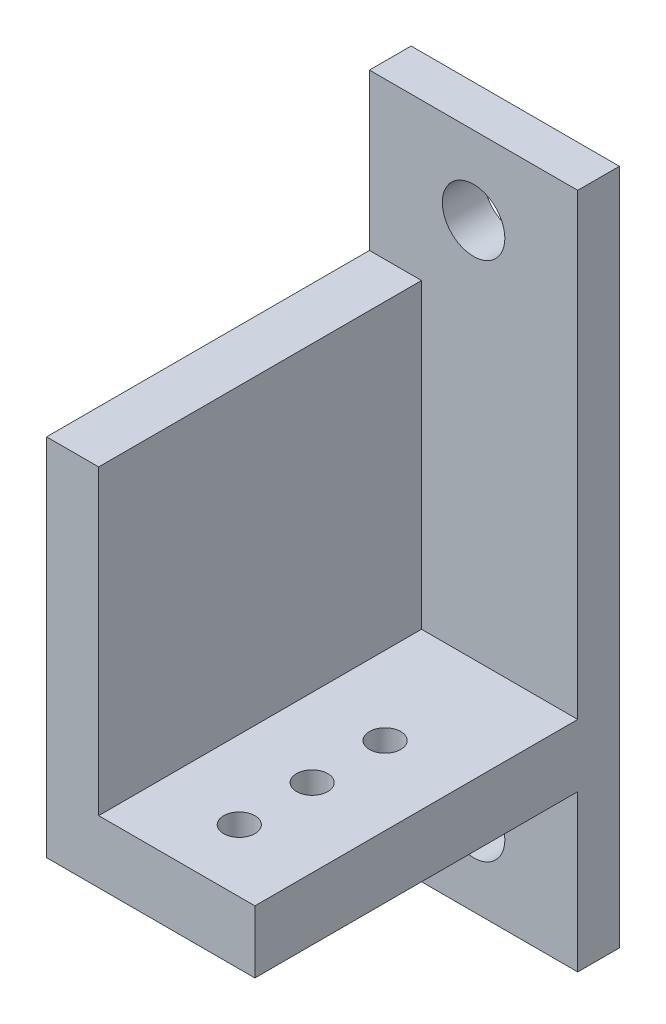
ISO-10303-21;
HEADER;
FILE_DESCRIPTION(('STEP AP214'),'2;1');
FILE_NAME('part.step','',(''),(''),'','','');
FILE_SCHEMA(('AUTOMOTIVE_DESIGN { 1 0 10303 214 1 1 1 1 }'));
ENDSEC;
DATA;
#1=APPLICATION_CONTEXT('core data for automotive mechanical design processes');
#2=APPLICATION_PROTOCOL_DEFINITION('international standard','automotive_design',2000,#1);
#3=PRODUCT_CONTEXT('',#1,'mechanical');
#4=PRODUCT('Part','Part','',(#3));
#5=PRODUCT_RELATED_PRODUCT_CATEGORY('part','',(#4));
#6=PRODUCT_DEFINITION_FORMATION('','',#4);
#7=PRODUCT_DEFINITION_CONTEXT('part definition',#1,'design');
#8=PRODUCT_DEFINITION('design','',#6,#7);
#9=PRODUCT_DEFINITION_SHAPE('','',#8);
#10=(LENGTH_UNIT() NAMED_UNIT(*) SI_UNIT(.MILLI.,.METRE.));
#11=(NAMED_UNIT(*) PLANE_ANGLE_UNIT() SI_UNIT($,.RADIAN.));
#12=(NAMED_UNIT(*) SI_UNIT($,.STERADIAN.) SOLID_ANGLE_UNIT());
#13=UNCERTAINTY_MEASURE_WITH_UNIT(LENGTH_MEASURE(1.E-05),#10,'distance_accuracy_value','');
#14=(GEOMETRIC_REPRESENTATION_CONTEXT(3) GLOBAL_UNCERTAINTY_ASSIGNED_CONTEXT((#13)) GLOBAL_UNIT_ASSIGNED_CONTEXT((#10,
#11,#12)) REPRESENTATION_CONTEXT('',''));
#15=CARTESIAN_POINT('',(0.,0.,0.));
#16=DIRECTION('',(0.,0.,1.));
#17=DIRECTION('',(1.,0.,0.));
#18=AXIS2_PLACEMENT_3D('',#15,#16,#17);
#19=CARTESIAN_POINT('',(-7.63104892590161,-13.3543356203278,35.));
#20=DIRECTION('',(0.,1.,0.));
#21=DIRECTION('',(0.,0.,1.));
#22=AXIS2_PLACEMENT_3D('',#19,#20,#21);
#23=PLANE('',#22);
#24=CARTESIAN_POINT('',(4.86895107409839,-13.3543356203278,22.));
#25=DIRECTION('',(0.,-1.,0.));
#26=DIRECTION('',(0.,0.,-1.));
#27=AXIS2_PLACEMENT_3D('',#24,#25,#26);
#28=CIRCLE('',#27,1.5);
#29=CARTESIAN_POINT('',(4.86895107409839,-13.3543356203278,20.5));
#30=VERTEX_POINT('',#29);
#31=EDGE_CURVE('E161',#30,#30,#28,.T.);
#32=ORIENTED_EDGE('',*,*,#31,.F.);
#33=EDGE_LOOP('',(#32));
#34=FACE_BOUND('',#33,.T.);
#35=CARTESIAN_POINT('',(4.86895107409839,-13.3543356203278,29.));
#36=DIRECTION('',(0.,-1.,0.));
#37=DIRECTION('',(0.,0.,-1.));
#38=AXIS2_PLACEMENT_3D('',#35,#36,#37);
#39=CIRCLE('',#38,1.5);
#40=CARTESIAN_POINT('',(4.86895107409839,-13.3543356203278,27.5));
#41=VERTEX_POINT('',#40);
#42=EDGE_CURVE('E165',#41,#41,#39,.T.);
#43=ORIENTED_EDGE('',*,*,#42,.F.);
#44=EDGE_LOOP('',(#43));
#45=FACE_BOUND('',#44,.T.);
#46=CARTESIAN_POINT('',(4.86895107409839,-13.3543356203278,15.));
#47=DIRECTION('',(0.,-1.,0.));
#48=DIRECTION('',(0.,0.,-1.));
#49=AXIS2_PLACEMENT_3D('',#46,#47,#48);
#50=CIRCLE('',#49,1.5);
#51=CARTESIAN_POINT('',(4.86895107409839,-13.3543356203278,13.5));
#52=VERTEX_POINT('',#51);
#53=EDGE_CURVE('E171',#52,#52,#50,.T.);
#54=ORIENTED_EDGE('',*,*,#53,.F.);
#55=EDGE_LOOP('',(#54));
#56=FACE_BOUND('',#55,.T.);
#57=DIRECTION('',(-1.,0.,0.));
#58=VECTOR('',#57,1.);
#59=CARTESIAN_POINT('',(12.3689510740984,-13.3543356203278,4.));
#60=LINE('',#59,#58);
#61=CARTESIAN_POINT('',(12.3689510740984,-13.3543356203278,4.));
#62=VERTEX_POINT('',#61);
#63=CARTESIAN_POINT('',(-7.63104892590161,-13.3543356203278,4.));
#64=VERTEX_POINT('',#63);
#65=EDGE_CURVE('E48',#62,#64,#60,.T.);
#66=ORIENTED_EDGE('',*,*,#65,.F.);
#67=DIRECTION('',(0.,0.,1.));
#68=VECTOR('',#67,1.);
#69=CARTESIAN_POINT('',(12.3689510740984,-13.3543356203278,0.));
#70=LINE('',#69,#68);
#71=CARTESIAN_POINT('',(12.3689510740984,-13.3543356203278,35.));
#72=VERTEX_POINT('',#71);
#73=EDGE_CURVE('E177',#62,#72,#70,.T.);
#74=ORIENTED_EDGE('',*,*,#73,.T.);
#75=DIRECTION('',(1.,0.,0.));
#76=VECTOR('',#75,1.);
#77=CARTESIAN_POINT('',(-7.63104892590161,-13.3543356203278,35.));
#78=LINE('',#77,#76);
#79=CARTESIAN_POINT('',(-7.63104892590161,-13.3543356203278,35.));
#80=VERTEX_POINT('',#79);
#81=EDGE_CURVE('E198',#80,#72,#78,.T.);
#82=ORIENTED_EDGE('',*,*,#81,.F.);
#83=DIRECTION('',(0.,0.,-1.));
#84=VECTOR('',#83,1.);
#85=CARTESIAN_POINT('',(-7.63104892590161,-13.3543356203278,35.));
#86=LINE('',#85,#84);
#87=EDGE_CURVE('E203',#80,#64,#86,.T.);
#88=ORIENTED_EDGE('',*,*,#87,.T.);
#89=EDGE_LOOP('',(#66,#74,#82,#88));
#90=FACE_BOUND('',#89,.T.);
#91=ADVANCED_FACE('F33',(#34,#45,#56,#90),#23,.F.);
#92=CARTESIAN_POINT('',(-7.63104892590161,21.6456643796722,35.));
#93=DIRECTION('',(0.,-1.,0.));
#94=DIRECTION('',(0.,0.,-1.));
#95=AXIS2_PLACEMENT_3D('',#92,#93,#94);
#96=PLANE('',#95);
#97=DIRECTION('',(1.,0.,0.));
#98=VECTOR('',#97,1.);
#99=CARTESIAN_POINT('',(-2.63104892590161,21.6456643796722,4.));
#100=LINE('',#99,#98);
#101=CARTESIAN_POINT('',(-7.63104892590161,21.6456643796722,4.));
#102=VERTEX_POINT('',#101);
#103=CARTESIAN_POINT('',(-2.63104892590161,21.6456643796722,4.));
#104=VERTEX_POINT('',#103);
#105=EDGE_CURVE('E56',#102,#104,#100,.T.);
#106=ORIENTED_EDGE('',*,*,#105,.F.);
#107=DIRECTION('',(0.,0.,-1.));
#108=VECTOR('',#107,1.);
#109=CARTESIAN_POINT('',(-7.63104892590161,21.6456643796722,35.));
#110=LINE('',#109,#108);
#111=CARTESIAN_POINT('',(-7.63104892590161,21.6456643796722,35.));
#112=VERTEX_POINT('',#111);
#113=EDGE_CURVE('E41',#112,#102,#110,.T.);
#114=ORIENTED_EDGE('',*,*,#113,.F.);
#115=DIRECTION('',(-1.,0.,0.));
#116=VECTOR('',#115,1.);
#117=CARTESIAN_POINT('',(-7.63104892590161,21.6456643796722,35.));
#118=LINE('',#117,#116);
#119=CARTESIAN_POINT('',(-2.63104892590161,21.6456643796722,35.));
#120=VERTEX_POINT('',#119);
#121=EDGE_CURVE('E194',#120,#112,#118,.T.);
#122=ORIENTED_EDGE('',*,*,#121,.F.);
#123=DIRECTION('',(0.,0.,-1.));
#124=VECTOR('',#123,1.);
#125=CARTESIAN_POINT('',(-2.63104892590161,21.6456643796722,35.));
#126=LINE('',#125,#124);
#127=EDGE_CURVE('E158',#120,#104,#126,.T.);
#128=ORIENTED_EDGE('',*,*,#127,.T.);
#129=EDGE_LOOP('',(#106,#114,#122,#128));
#130=FACE_BOUND('',#129,.T.);
#131=ADVANCED_FACE('F35',(#130),#96,.F.);
#132=CARTESIAN_POINT('',(-2.63104892590161,15.6456643796722,35.));
#133=DIRECTION('',(-1.,0.,0.));
#134=DIRECTION('',(0.,-1.,0.));
#135=AXIS2_PLACEMENT_3D('',#132,#133,#134);
#136=PLANE('',#135);
#137=DIRECTION('',(0.,-1.,0.));
#138=VECTOR('',#137,1.);
#139=CARTESIAN_POINT('',(-2.63104892590161,15.6456643796722,4.));
#140=LINE('',#139,#138);
#141=CARTESIAN_POINT('',(-2.63104892590161,-7.35433562032781,4.));
#142=VERTEX_POINT('',#141);
#143=EDGE_CURVE('E156',#104,#142,#140,.T.);
#144=ORIENTED_EDGE('',*,*,#143,.F.);
#145=ORIENTED_EDGE('',*,*,#127,.F.);
#146=DIRECTION('',(0.,1.,0.));
#147=VECTOR('',#146,1.);
#148=CARTESIAN_POINT('',(-2.63104892590161,15.6456643796722,35.));
#149=LINE('',#148,#147);
#150=CARTESIAN_POINT('',(-2.6310489259016,-7.3543356203278,35.));
#151=VERTEX_POINT('',#150);
#152=EDGE_CURVE('E201',#151,#120,#149,.T.);
#153=ORIENTED_EDGE('',*,*,#152,.F.);
#154=DIRECTION('',(0.,0.,-1.));
#155=VECTOR('',#154,1.);
#156=CARTESIAN_POINT('',(-2.63104892590161,-7.35433562032781,35.));
#157=LINE('',#156,#155);
#158=EDGE_CURVE('E183',#151,#142,#157,.T.);
#159=ORIENTED_EDGE('',*,*,#158,.T.);
#160=EDGE_LOOP('',(#144,#145,#153,#159));
#161=FACE_BOUND('',#160,.T.);
#162=ADVANCED_FACE('F214',(#161),#136,.F.);
#163=CARTESIAN_POINT('',(0.,-7.35433562032781,0.));
#164=DIRECTION('',(0.,-1.,0.));
#165=DIRECTION('',(0.,0.,-1.));
#166=AXIS2_PLACEMENT_3D('',#163,#164,#165);
#167=PLANE('',#166);
#168=CARTESIAN_POINT('',(4.86895107409839,-7.35433562032781,15.));
#169=DIRECTION('',(0.,-1.,0.));
#170=DIRECTION('',(0.,0.,-1.));
#171=AXIS2_PLACEMENT_3D('',#168,#169,#170);
#172=CIRCLE('',#171,1.5);
#173=CARTESIAN_POINT('',(4.86895107409839,-7.35433562032781,13.5));
#174=VERTEX_POINT('',#173);
#175=EDGE_CURVE('E174',#174,#174,#172,.T.);
#176=ORIENTED_EDGE('',*,*,#175,.T.);
#177=EDGE_LOOP('',(#176));
#178=FACE_BOUND('',#177,.T.);
#179=CARTESIAN_POINT('',(4.86895107409839,-7.35433562032781,29.));
#180=DIRECTION('',(0.,-1.,0.));
#181=DIRECTION('',(0.,0.,-1.));
#182=AXIS2_PLACEMENT_3D('',#179,#180,#181);
#183=CIRCLE('',#182,1.5);
#184=CARTESIAN_POINT('',(4.86895107409839,-7.35433562032781,27.5));
#185=VERTEX_POINT('',#184);
#186=EDGE_CURVE('E168',#185,#185,#183,.T.);
#187=ORIENTED_EDGE('',*,*,#186,.T.);
#188=EDGE_LOOP('',(#187));
#189=FACE_BOUND('',#188,.T.);
#190=CARTESIAN_POINT('',(4.86895107409839,-7.35433562032781,22.));
#191=DIRECTION('',(0.,-1.,0.));
#192=DIRECTION('',(0.,0.,-1.));
#193=AXIS2_PLACEMENT_3D('',#190,#191,#192);
#194=CIRCLE('',#193,1.5);
#195=CARTESIAN_POINT('',(4.86895107409839,-7.35433562032781,20.5));
#196=VERTEX_POINT('',#195);
#197=EDGE_CURVE('E162',#196,#196,#194,.T.);
#198=ORIENTED_EDGE('',*,*,#197,.T.);
#199=EDGE_LOOP('',(#198));
#200=FACE_BOUND('',#199,.T.);
#201=DIRECTION('',(1.,0.,0.));
#202=VECTOR('',#201,1.);
#203=CARTESIAN_POINT('',(0.,-7.35433562032781,4.));
#204=LINE('',#203,#202);
#205=CARTESIAN_POINT('',(12.3689510740984,-7.35433562032781,4.));
#206=VERTEX_POINT('',#205);
#207=EDGE_CURVE('E11',#142,#206,#204,.T.);
#208=ORIENTED_EDGE('',*,*,#207,.F.);
#209=ORIENTED_EDGE('',*,*,#158,.F.);
#210=DIRECTION('',(-1.,0.,0.));
#211=VECTOR('',#210,1.);
#212=CARTESIAN_POINT('',(12.3689510740984,-7.35433562032781,35.));
#213=LINE('',#212,#211);
#214=CARTESIAN_POINT('',(12.3689510740984,-7.35433562032781,35.));
#215=VERTEX_POINT('',#214);
#216=EDGE_CURVE('E180',#215,#151,#213,.T.);
#217=ORIENTED_EDGE('',*,*,#216,.F.);
#218=DIRECTION('',(0.,0.,1.));
#219=VECTOR('',#218,1.);
#220=CARTESIAN_POINT('',(12.3689510740984,-7.35433562032781,0.));
#221=LINE('',#220,#219);
#222=EDGE_CURVE('E186',#206,#215,#221,.T.);
#223=ORIENTED_EDGE('',*,*,#222,.F.);
#224=EDGE_LOOP('',(#208,#209,#217,#223));
#225=FACE_BOUND('',#224,.T.);
#226=ADVANCED_FACE('F270',(#178,#189,#200,#225),#167,.F.);
#227=CARTESIAN_POINT('',(-7.63104892590161,-13.3543356203278,35.));
#228=DIRECTION('',(1.,0.,0.));
#229=DIRECTION('',(0.,0.,-1.));
#230=AXIS2_PLACEMENT_3D('',#227,#228,#229);
#231=PLANE('',#230);
#232=DIRECTION('',(0.,-1.,0.));
#233=VECTOR('',#232,1.);
#234=CARTESIAN_POINT('',(-7.63104892590161,-13.3543356203278,0.));
#235=LINE('',#234,#233);
#236=CARTESIAN_POINT('',(-7.63104892590161,36.6456643796722,0.));
#237=VERTEX_POINT('',#236);
#238=CARTESIAN_POINT('',(-7.63104892590161,-28.3543356203278,0.));
#239=VERTEX_POINT('',#238);
#240=EDGE_CURVE('E118',#237,#239,#235,.T.);
#241=ORIENTED_EDGE('',*,*,#240,.T.);
#242=DIRECTION('',(0.,0.,-1.));
#243=VECTOR('',#242,1.);
#244=CARTESIAN_POINT('',(-7.63104892590161,-28.3543356203278,4.));
#245=LINE('',#244,#243);
#246=CARTESIAN_POINT('',(-7.63104892590161,-28.3543356203278,4.));
#247=VERTEX_POINT('',#246);
#248=EDGE_CURVE('E111',#247,#239,#245,.T.);
#249=ORIENTED_EDGE('',*,*,#248,.F.);
#250=DIRECTION('',(0.,1.,0.));
#251=VECTOR('',#250,1.);
#252=CARTESIAN_POINT('',(-7.63104892590161,-28.3543356203278,4.));
#253=LINE('',#252,#251);
#254=EDGE_CURVE('E116',#247,#64,#253,.T.);
#255=ORIENTED_EDGE('',*,*,#254,.T.);
#256=ORIENTED_EDGE('',*,*,#87,.F.);
#257=DIRECTION('',(0.,-1.,0.));
#258=VECTOR('',#257,1.);
#259=CARTESIAN_POINT('',(-7.63104892590161,-13.3543356203278,35.));
#260=LINE('',#259,#258);
#261=EDGE_CURVE('E196',#112,#80,#260,.T.);
#262=ORIENTED_EDGE('',*,*,#261,.F.);
#263=ORIENTED_EDGE('',*,*,#113,.T.);
#264=DIRECTION('',(0.,-1.,0.));
#265=VECTOR('',#264,1.);
#266=CARTESIAN_POINT('',(-7.63104892590161,36.6456643796722,4.));
#267=LINE('',#266,#265);
#268=CARTESIAN_POINT('',(-7.63104892590161,36.6456643796722,4.));
#269=VERTEX_POINT('',#268);
#270=EDGE_CURVE('E150',#269,#102,#267,.T.);
#271=ORIENTED_EDGE('',*,*,#270,.F.);
#272=DIRECTION('',(0.,0.,1.));
#273=VECTOR('',#272,1.);
#274=CARTESIAN_POINT('',(-7.63104892590161,36.6456643796722,0.));
#275=LINE('',#274,#273);
#276=EDGE_CURVE('E146',#237,#269,#275,.T.);
#277=ORIENTED_EDGE('',*,*,#276,.F.);
#278=EDGE_LOOP('',(#241,#249,#255,#256,#262,#263,#271,#277));
#279=FACE_BOUND('',#278,.T.);
#280=ADVANCED_FACE('F113',(#279),#231,.F.);
#281=CARTESIAN_POINT('',(0.,0.,35.));
#282=DIRECTION('',(0.,0.,-1.));
#283=DIRECTION('',(-1.,0.,0.));
#284=AXIS2_PLACEMENT_3D('',#281,#282,#283);
#285=PLANE('',#284);
#286=ORIENTED_EDGE('',*,*,#152,.T.);
#287=ORIENTED_EDGE('',*,*,#121,.T.);
#288=ORIENTED_EDGE('',*,*,#261,.T.);
#289=ORIENTED_EDGE('',*,*,#81,.T.);
#290=DIRECTION('',(0.,-1.,0.));
#291=VECTOR('',#290,1.);
#292=CARTESIAN_POINT('',(12.3689510740984,-7.35433562032781,35.));
#293=LINE('',#292,#291);
#294=EDGE_CURVE('E190',#215,#72,#293,.T.);
#295=ORIENTED_EDGE('',*,*,#294,.F.);
#296=ORIENTED_EDGE('',*,*,#216,.T.);
#297=EDGE_LOOP('',(#286,#287,#288,#289,#295,#296));
#298=FACE_BOUND('',#297,.T.);
#299=ADVANCED_FACE('F269',(#298),#285,.F.);
#300=CARTESIAN_POINT('',(0.,0.,0.));
#301=DIRECTION('',(0.,0.,-1.));
#302=DIRECTION('',(-1.,0.,0.));
#303=AXIS2_PLACEMENT_3D('',#300,#301,#302);
#304=PLANE('',#303);
#305=CARTESIAN_POINT('',(2.36895107409839,29.1456643796722,0.));
#306=DIRECTION('',(0.,0.,-1.));
#307=DIRECTION('',(-1.,0.,0.));
#308=AXIS2_PLACEMENT_3D('',#305,#306,#307);
#309=CIRCLE('',#308,3.);
#310=CARTESIAN_POINT('',(-0.631048925901611,29.1456643796722,0.));
#311=VERTEX_POINT('',#310);
#312=EDGE_CURVE('E236',#311,#311,#309,.T.);
#313=ORIENTED_EDGE('',*,*,#312,.F.);
#314=EDGE_LOOP('',(#313));
#315=FACE_BOUND('',#314,.T.);
#316=CARTESIAN_POINT('',(2.36895107409839,-20.8543356203278,0.));
#317=DIRECTION('',(0.,0.,-1.));
#318=DIRECTION('',(-1.,0.,0.));
#319=AXIS2_PLACEMENT_3D('',#316,#317,#318);
#320=CIRCLE('',#319,3.);
#321=CARTESIAN_POINT('',(-0.631048925901609,-20.8543356203278,0.));
#322=VERTEX_POINT('',#321);
#323=EDGE_CURVE('E229',#322,#322,#320,.T.);
#324=ORIENTED_EDGE('',*,*,#323,.F.);
#325=EDGE_LOOP('',(#324));
#326=FACE_BOUND('',#325,.T.);
#327=ORIENTED_EDGE('',*,*,#240,.F.);
#328=DIRECTION('',(-1.,0.,0.));
#329=VECTOR('',#328,1.);
#330=CARTESIAN_POINT('',(12.3689510740984,36.6456643796722,0.));
#331=LINE('',#330,#329);
#332=CARTESIAN_POINT('',(12.3689510740984,36.6456643796722,0.));
#333=VERTEX_POINT('',#332);
#334=EDGE_CURVE('E143',#333,#237,#331,.T.);
#335=ORIENTED_EDGE('',*,*,#334,.F.);
#336=DIRECTION('',(0.,-1.,0.));
#337=VECTOR('',#336,1.);
#338=CARTESIAN_POINT('',(12.3689510740984,-7.35433562032781,0.));
#339=LINE('',#338,#337);
#340=CARTESIAN_POINT('',(12.3689510740984,-28.3543356203278,0.));
#341=VERTEX_POINT('',#340);
#342=EDGE_CURVE('E188',#333,#341,#339,.T.);
#343=ORIENTED_EDGE('',*,*,#342,.T.);
#344=DIRECTION('',(1.,0.,0.));
#345=VECTOR('',#344,1.);
#346=CARTESIAN_POINT('',(-7.63104892590161,-28.3543356203278,0.));
#347=LINE('',#346,#345);
#348=EDGE_CURVE('E122',#239,#341,#347,.T.);
#349=ORIENTED_EDGE('',*,*,#348,.F.);
#350=EDGE_LOOP('',(#327,#335,#343,#349));
#351=FACE_BOUND('',#350,.T.);
#352=ADVANCED_FACE('F226',(#315,#326,#351),#304,.T.);
#353=CARTESIAN_POINT('',(12.3689510740984,-7.35433562032781,0.));
#354=DIRECTION('',(1.,0.,0.));
#355=DIRECTION('',(0.,0.,-1.));
#356=AXIS2_PLACEMENT_3D('',#353,#354,#355);
#357=PLANE('',#356);
#358=DIRECTION('',(0.,-1.,0.));
#359=VECTOR('',#358,1.);
#360=CARTESIAN_POINT('',(12.3689510740984,21.6456643796722,4.));
#361=LINE('',#360,#359);
#362=CARTESIAN_POINT('',(12.3689510740984,36.6456643796722,4.));
#363=VERTEX_POINT('',#362);
#364=EDGE_CURVE('E153',#363,#206,#361,.T.);
#365=ORIENTED_EDGE('',*,*,#364,.T.);
#366=ORIENTED_EDGE('',*,*,#222,.T.);
#367=ORIENTED_EDGE('',*,*,#294,.T.);
#368=ORIENTED_EDGE('',*,*,#73,.F.);
#369=DIRECTION('',(0.,1.,0.));
#370=VECTOR('',#369,1.);
#371=CARTESIAN_POINT('',(12.3689510740984,-28.3543356203278,4.));
#372=LINE('',#371,#370);
#373=CARTESIAN_POINT('',(12.3689510740984,-28.3543356203278,4.));
#374=VERTEX_POINT('',#373);
#375=EDGE_CURVE('E134',#374,#62,#372,.T.);
#376=ORIENTED_EDGE('',*,*,#375,.F.);
#377=DIRECTION('',(0.,0.,1.));
#378=VECTOR('',#377,1.);
#379=CARTESIAN_POINT('',(12.3689510740984,-28.3543356203278,0.));
#380=LINE('',#379,#378);
#381=EDGE_CURVE('E128',#341,#374,#380,.T.);
#382=ORIENTED_EDGE('',*,*,#381,.F.);
#383=ORIENTED_EDGE('',*,*,#342,.F.);
#384=DIRECTION('',(0.,0.,-1.));
#385=VECTOR('',#384,1.);
#386=CARTESIAN_POINT('',(12.3689510740984,36.6456643796722,4.));
#387=LINE('',#386,#385);
#388=EDGE_CURVE('E136',#363,#333,#387,.T.);
#389=ORIENTED_EDGE('',*,*,#388,.F.);
#390=EDGE_LOOP('',(#365,#366,#367,#368,#376,#382,#383,#389));
#391=FACE_BOUND('',#390,.T.);
#392=ADVANCED_FACE('F220',(#391),#357,.T.);
#393=CARTESIAN_POINT('',(4.86895107409839,-7.35433562032781,15.));
#394=DIRECTION('',(0.,-1.,0.));
#395=DIRECTION('',(0.,0.,-1.));
#396=AXIS2_PLACEMENT_3D('',#393,#394,#395);
#397=CYLINDRICAL_SURFACE('',#396,1.5);
#398=ORIENTED_EDGE('',*,*,#175,.F.);
#399=EDGE_LOOP('',(#398));
#400=FACE_BOUND('',#399,.T.);
#401=ORIENTED_EDGE('',*,*,#53,.T.);
#402=EDGE_LOOP('',(#401));
#403=FACE_BOUND('',#402,.T.);
#404=ADVANCED_FACE('F285',(#400,#403),#397,.F.);
#405=CARTESIAN_POINT('',(4.86895107409839,-7.35433562032781,29.));
#406=DIRECTION('',(0.,-1.,0.));
#407=DIRECTION('',(0.,0.,-1.));
#408=AXIS2_PLACEMENT_3D('',#405,#406,#407);
#409=CYLINDRICAL_SURFACE('',#408,1.5);
#410=ORIENTED_EDGE('',*,*,#186,.F.);
#411=EDGE_LOOP('',(#410));
#412=FACE_BOUND('',#411,.T.);
#413=ORIENTED_EDGE('',*,*,#42,.T.);
#414=EDGE_LOOP('',(#413));
#415=FACE_BOUND('',#414,.T.);
#416=ADVANCED_FACE('F255',(#412,#415),#409,.F.);
#417=CARTESIAN_POINT('',(4.86895107409839,-7.35433562032781,22.));
#418=DIRECTION('',(0.,-1.,0.));
#419=DIRECTION('',(0.,0.,-1.));
#420=AXIS2_PLACEMENT_3D('',#417,#418,#419);
#421=CYLINDRICAL_SURFACE('',#420,1.5);
#422=ORIENTED_EDGE('',*,*,#197,.F.);
#423=EDGE_LOOP('',(#422));
#424=FACE_BOUND('',#423,.T.);
#425=ORIENTED_EDGE('',*,*,#31,.T.);
#426=EDGE_LOOP('',(#425));
#427=FACE_BOUND('',#426,.T.);
#428=ADVANCED_FACE('F248',(#424,#427),#421,.F.);
#429=CARTESIAN_POINT('',(47.5967809817155,21.6456643796722,4.));
#430=DIRECTION('',(0.,0.,-1.));
#431=DIRECTION('',(0.,1.,0.));
#432=AXIS2_PLACEMENT_3D('',#429,#430,#431);
#433=PLANE('',#432);
#434=CARTESIAN_POINT('',(2.36895107409839,29.1456643796722,4.));
#435=DIRECTION('',(0.,0.,1.));
#436=DIRECTION('',(1.,0.,0.));
#437=AXIS2_PLACEMENT_3D('',#434,#435,#436);
#438=CIRCLE('',#437,3.);
#439=CARTESIAN_POINT('',(5.36895107409839,29.1456643796722,4.));
#440=VERTEX_POINT('',#439);
#441=EDGE_CURVE('E241',#440,#440,#438,.T.);
#442=ORIENTED_EDGE('',*,*,#441,.F.);
#443=EDGE_LOOP('',(#442));
#444=FACE_BOUND('',#443,.T.);
#445=ORIENTED_EDGE('',*,*,#364,.F.);
#446=DIRECTION('',(1.,0.,0.));
#447=VECTOR('',#446,1.);
#448=CARTESIAN_POINT('',(-2.63104892590161,36.6456643796722,4.));
#449=LINE('',#448,#447);
#450=EDGE_CURVE('E148',#269,#363,#449,.T.);
#451=ORIENTED_EDGE('',*,*,#450,.F.);
#452=ORIENTED_EDGE('',*,*,#270,.T.);
#453=ORIENTED_EDGE('',*,*,#105,.T.);
#454=ORIENTED_EDGE('',*,*,#143,.T.);
#455=ORIENTED_EDGE('',*,*,#207,.T.);
#456=EDGE_LOOP('',(#445,#451,#452,#453,#454,#455));
#457=FACE_BOUND('',#456,.T.);
#458=ADVANCED_FACE('F216',(#444,#457),#433,.F.);
#459=CARTESIAN_POINT('',(0.,36.6456643796722,0.));
#460=DIRECTION('',(0.,1.,0.));
#461=DIRECTION('',(0.,0.,1.));
#462=AXIS2_PLACEMENT_3D('',#459,#460,#461);
#463=PLANE('',#462);
#464=ORIENTED_EDGE('',*,*,#388,.T.);
#465=ORIENTED_EDGE('',*,*,#334,.T.);
#466=ORIENTED_EDGE('',*,*,#276,.T.);
#467=ORIENTED_EDGE('',*,*,#450,.T.);
#468=EDGE_LOOP('',(#464,#465,#466,#467));
#469=FACE_BOUND('',#468,.T.);
#470=ADVANCED_FACE('F224',(#469),#463,.T.);
#471=CARTESIAN_POINT('',(12.3689510740984,-28.3543356203278,4.));
#472=DIRECTION('',(0.,0.,-1.));
#473=DIRECTION('',(-1.,0.,0.));
#474=AXIS2_PLACEMENT_3D('',#471,#472,#473);
#475=PLANE('',#474);
#476=CARTESIAN_POINT('',(2.36895107409839,-20.8543356203278,4.));
#477=DIRECTION('',(0.,0.,1.));
#478=DIRECTION('',(1.,0.,0.));
#479=AXIS2_PLACEMENT_3D('',#476,#477,#478);
#480=CIRCLE('',#479,3.);
#481=CARTESIAN_POINT('',(5.36895107409839,-20.8543356203278,4.));
#482=VERTEX_POINT('',#481);
#483=EDGE_CURVE('E231',#482,#482,#480,.T.);
#484=ORIENTED_EDGE('',*,*,#483,.F.);
#485=EDGE_LOOP('',(#484));
#486=FACE_BOUND('',#485,.T.);
#487=ORIENTED_EDGE('',*,*,#65,.T.);
#488=ORIENTED_EDGE('',*,*,#254,.F.);
#489=DIRECTION('',(-1.,0.,0.));
#490=VECTOR('',#489,1.);
#491=CARTESIAN_POINT('',(12.3689510740984,-28.3543356203278,4.));
#492=LINE('',#491,#490);
#493=EDGE_CURVE('E123',#374,#247,#492,.T.);
#494=ORIENTED_EDGE('',*,*,#493,.F.);
#495=ORIENTED_EDGE('',*,*,#375,.T.);
#496=EDGE_LOOP('',(#487,#488,#494,#495));
#497=FACE_BOUND('',#496,.T.);
#498=ADVANCED_FACE('F133',(#486,#497),#475,.F.);
#499=CARTESIAN_POINT('',(0.,-28.3543356203278,0.));
#500=DIRECTION('',(0.,-1.,0.));
#501=DIRECTION('',(0.,0.,-1.));
#502=AXIS2_PLACEMENT_3D('',#499,#500,#501);
#503=PLANE('',#502);
#504=ORIENTED_EDGE('',*,*,#493,.T.);
#505=ORIENTED_EDGE('',*,*,#248,.T.);
#506=ORIENTED_EDGE('',*,*,#348,.T.);
#507=ORIENTED_EDGE('',*,*,#381,.T.);
#508=EDGE_LOOP('',(#504,#505,#506,#507));
#509=FACE_BOUND('',#508,.T.);
#510=ADVANCED_FACE('F126',(#509),#503,.T.);
#511=CARTESIAN_POINT('',(2.36895107409839,-20.8543356203278,-11.));
#512=DIRECTION('',(0.,0.,1.));
#513=DIRECTION('',(1.,0.,0.));
#514=AXIS2_PLACEMENT_3D('',#511,#512,#513);
#515=CYLINDRICAL_SURFACE('',#514,3.);
#516=ORIENTED_EDGE('',*,*,#323,.T.);
#517=EDGE_LOOP('',(#516));
#518=FACE_BOUND('',#517,.T.);
#519=ORIENTED_EDGE('',*,*,#483,.T.);
#520=EDGE_LOOP('',(#519));
#521=FACE_BOUND('',#520,.T.);
#522=ADVANCED_FACE('F296',(#518,#521),#515,.F.);
#523=CARTESIAN_POINT('',(2.36895107409839,29.1456643796722,-11.));
#524=DIRECTION('',(0.,0.,1.));
#525=DIRECTION('',(1.,0.,0.));
#526=AXIS2_PLACEMENT_3D('',#523,#524,#525);
#527=CYLINDRICAL_SURFACE('',#526,3.);
#528=ORIENTED_EDGE('',*,*,#312,.T.);
#529=EDGE_LOOP('',(#528));
#530=FACE_BOUND('',#529,.T.);
#531=ORIENTED_EDGE('',*,*,#441,.T.);
#532=EDGE_LOOP('',(#531));
#533=FACE_BOUND('',#532,.T.);
#534=ADVANCED_FACE('F245',(#530,#533),#527,.F.);
#535=CLOSED_SHELL('',(#91,#131,#162,#226,#280,#299,#352,#392,#404,#416,#428,#458,#470,#498,#510,
#522,#534));
#536=MANIFOLD_SOLID_BREP('B2',#535);
#537=ADVANCED_BREP_SHAPE_REPRESENTATION('',(#18,#536),#14);
#538=SHAPE_DEFINITION_REPRESENTATION(#9,#537);
ENDSEC;
END-ISO-10303-21;
